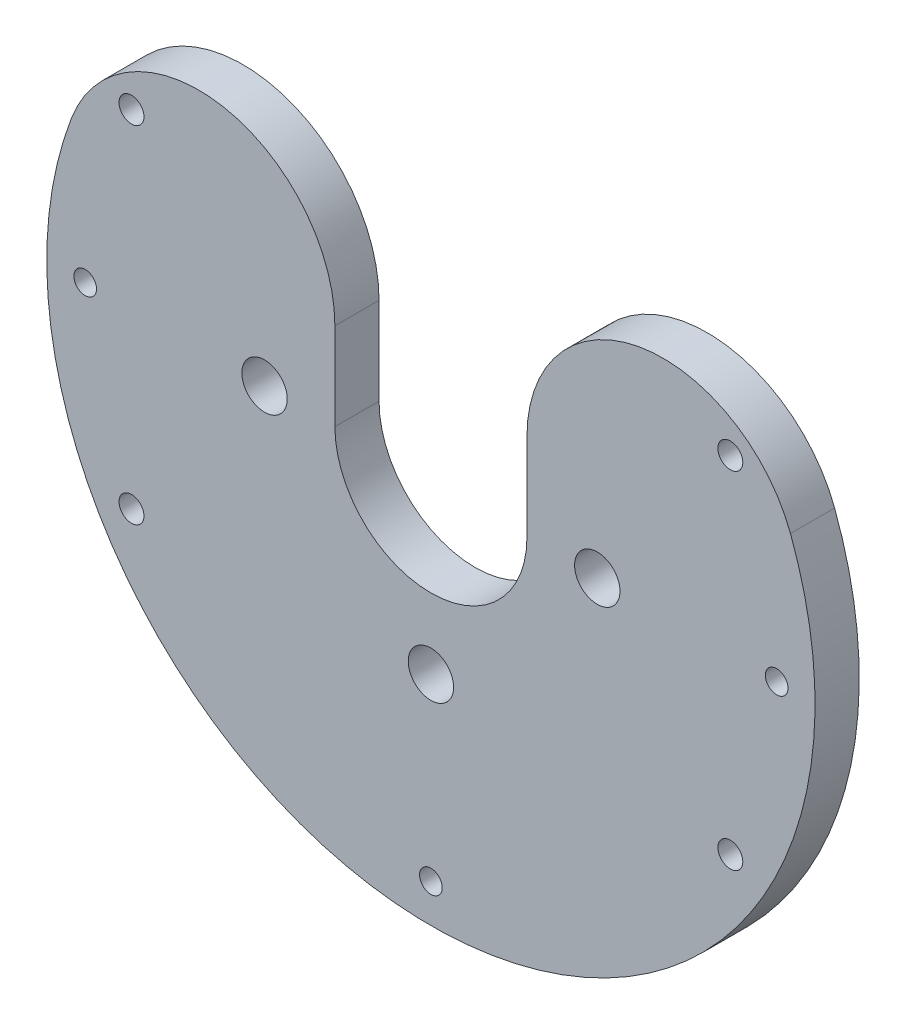
ISO-10303-21;
HEADER;
FILE_DESCRIPTION(('STEP AP214'),'2;1');
FILE_NAME('part.step','',(''),(''),'','','');
FILE_SCHEMA(('AUTOMOTIVE_DESIGN { 1 0 10303 214 1 1 1 1 }'));
ENDSEC;
DATA;
#1=APPLICATION_CONTEXT('core data for automotive mechanical design processes');
#2=APPLICATION_PROTOCOL_DEFINITION('international standard','automotive_design',2000,#1);
#3=PRODUCT_CONTEXT('',#1,'mechanical');
#4=PRODUCT('Part','Part','',(#3));
#5=PRODUCT_RELATED_PRODUCT_CATEGORY('part','',(#4));
#6=PRODUCT_DEFINITION_FORMATION('','',#4);
#7=PRODUCT_DEFINITION_CONTEXT('part definition',#1,'design');
#8=PRODUCT_DEFINITION('design','',#6,#7);
#9=PRODUCT_DEFINITION_SHAPE('','',#8);
#10=(LENGTH_UNIT() NAMED_UNIT(*) SI_UNIT(.MILLI.,.METRE.));
#11=(NAMED_UNIT(*) PLANE_ANGLE_UNIT() SI_UNIT($,.RADIAN.));
#12=(NAMED_UNIT(*) SI_UNIT($,.STERADIAN.) SOLID_ANGLE_UNIT());
#13=UNCERTAINTY_MEASURE_WITH_UNIT(LENGTH_MEASURE(1.E-05),#10,'distance_accuracy_value','');
#14=(GEOMETRIC_REPRESENTATION_CONTEXT(3) GLOBAL_UNCERTAINTY_ASSIGNED_CONTEXT((#13)) GLOBAL_UNIT_ASSIGNED_CONTEXT((#10,
#11,#12)) REPRESENTATION_CONTEXT('',''));
#15=CARTESIAN_POINT('',(0.,0.,0.));
#16=DIRECTION('',(0.,0.,1.));
#17=DIRECTION('',(1.,0.,0.));
#18=AXIS2_PLACEMENT_3D('',#15,#16,#17);
#19=CARTESIAN_POINT('',(0.,0.,5.842));
#20=DIRECTION('',(0.,0.,-1.));
#21=DIRECTION('',(-1.,0.,0.));
#22=AXIS2_PLACEMENT_3D('',#19,#20,#21);
#23=CYLINDRICAL_SURFACE('',#22,12.7);
#24=CARTESIAN_POINT('',(0.,0.,0.));
#25=DIRECTION('',(0.,0.,1.));
#26=DIRECTION('',(1.,0.,0.));
#27=AXIS2_PLACEMENT_3D('',#24,#25,#26);
#28=CIRCLE('',#27,12.7);
#29=CARTESIAN_POINT('',(-12.7,0.,0.));
#30=VERTEX_POINT('',#29);
#31=CARTESIAN_POINT('',(12.7,0.,0.));
#32=VERTEX_POINT('',#31);
#33=EDGE_CURVE('E97',#30,#32,#28,.T.);
#34=ORIENTED_EDGE('',*,*,#33,.F.);
#35=DIRECTION('',(0.,0.,-1.));
#36=VECTOR('',#35,1.);
#37=CARTESIAN_POINT('',(-12.7,0.,5.842));
#38=LINE('',#37,#36);
#39=CARTESIAN_POINT('',(-12.7,0.,5.842));
#40=VERTEX_POINT('',#39);
#41=EDGE_CURVE('E92',#40,#30,#38,.T.);
#42=ORIENTED_EDGE('',*,*,#41,.F.);
#43=CARTESIAN_POINT('',(0.,0.,5.842));
#44=DIRECTION('',(0.,0.,1.));
#45=DIRECTION('',(1.,0.,0.));
#46=AXIS2_PLACEMENT_3D('',#43,#44,#45);
#47=CIRCLE('',#46,12.7);
#48=CARTESIAN_POINT('',(12.7,0.,5.842));
#49=VERTEX_POINT('',#48);
#50=EDGE_CURVE('E94',#40,#49,#47,.T.);
#51=ORIENTED_EDGE('',*,*,#50,.T.);
#52=DIRECTION('',(0.,0.,-1.));
#53=VECTOR('',#52,1.);
#54=CARTESIAN_POINT('',(12.7,0.,5.842));
#55=LINE('',#54,#53);
#56=EDGE_CURVE('E100',#49,#32,#55,.T.);
#57=ORIENTED_EDGE('',*,*,#56,.T.);
#58=EDGE_LOOP('',(#34,#42,#51,#57));
#59=FACE_BOUND('',#58,.T.);
#60=ADVANCED_FACE('F37',(#59),#23,.F.);
#61=CARTESIAN_POINT('',(-12.7,0.,5.842));
#62=DIRECTION('',(-1.,0.,0.));
#63=DIRECTION('',(0.,0.,1.));
#64=AXIS2_PLACEMENT_3D('',#61,#62,#63);
#65=PLANE('',#64);
#66=DIRECTION('',(0.,1.,0.));
#67=VECTOR('',#66,1.);
#68=CARTESIAN_POINT('',(-12.7,0.,0.));
#69=LINE('',#68,#67);
#70=CARTESIAN_POINT('',(-12.7,11.5477270490777,0.));
#71=VERTEX_POINT('',#70);
#72=EDGE_CURVE('E151',#30,#71,#69,.T.);
#73=ORIENTED_EDGE('',*,*,#72,.T.);
#74=DIRECTION('',(0.,0.,-1.));
#75=VECTOR('',#74,1.);
#76=CARTESIAN_POINT('',(-12.7,11.5477270490777,5.842));
#77=LINE('',#76,#75);
#78=CARTESIAN_POINT('',(-12.7,11.5477270490777,5.842));
#79=VERTEX_POINT('',#78);
#80=EDGE_CURVE('E11',#71,#79,#77,.F.);
#81=ORIENTED_EDGE('',*,*,#80,.T.);
#82=DIRECTION('',(0.,1.,0.));
#83=VECTOR('',#82,1.);
#84=CARTESIAN_POINT('',(-12.7,0.,5.842));
#85=LINE('',#84,#83);
#86=EDGE_CURVE('E102',#40,#79,#85,.T.);
#87=ORIENTED_EDGE('',*,*,#86,.F.);
#88=ORIENTED_EDGE('',*,*,#41,.T.);
#89=EDGE_LOOP('',(#73,#81,#87,#88));
#90=FACE_BOUND('',#89,.T.);
#91=ADVANCED_FACE('F103',(#90),#65,.F.);
#92=CARTESIAN_POINT('',(0.,0.,5.842));
#93=DIRECTION('',(0.,0.,-1.));
#94=DIRECTION('',(-1.,0.,0.));
#95=AXIS2_PLACEMENT_3D('',#92,#93,#94);
#96=CYLINDRICAL_SURFACE('',#95,50.8);
#97=CARTESIAN_POINT('',(0.,0.,0.));
#98=DIRECTION('',(0.,0.,1.));
#99=DIRECTION('',(1.,0.,0.));
#100=AXIS2_PLACEMENT_3D('',#97,#98,#99);
#101=CIRCLE('',#100,50.8);
#102=CARTESIAN_POINT('',(-47.5475609756098,17.8848943321081,0.));
#103=VERTEX_POINT('',#102);
#104=CARTESIAN_POINT('',(47.5475609756098,17.8848943321081,0.));
#105=VERTEX_POINT('',#104);
#106=EDGE_CURVE('E153',#103,#105,#101,.T.);
#107=ORIENTED_EDGE('',*,*,#106,.T.);
#108=DIRECTION('',(0.,0.,-1.));
#109=VECTOR('',#108,1.);
#110=CARTESIAN_POINT('',(47.5475609756098,17.8848943321081,5.842));
#111=LINE('',#110,#109);
#112=CARTESIAN_POINT('',(47.5475609756098,17.8848943321081,5.842));
#113=VERTEX_POINT('',#112);
#114=EDGE_CURVE('E58',#105,#113,#111,.F.);
#115=ORIENTED_EDGE('',*,*,#114,.T.);
#116=CARTESIAN_POINT('',(0.,0.,5.842));
#117=DIRECTION('',(0.,0.,1.));
#118=DIRECTION('',(1.,0.,0.));
#119=AXIS2_PLACEMENT_3D('',#116,#117,#118);
#120=CIRCLE('',#119,50.8);
#121=CARTESIAN_POINT('',(-47.5475609756098,17.8848943321081,5.842));
#122=VERTEX_POINT('',#121);
#123=EDGE_CURVE('E106',#122,#113,#120,.T.);
#124=ORIENTED_EDGE('',*,*,#123,.F.);
#125=DIRECTION('',(0.,0.,-1.));
#126=VECTOR('',#125,1.);
#127=CARTESIAN_POINT('',(-47.5475609756098,17.8848943321081,5.842));
#128=LINE('',#127,#126);
#129=EDGE_CURVE('E166',#122,#103,#128,.T.);
#130=ORIENTED_EDGE('',*,*,#129,.T.);
#131=EDGE_LOOP('',(#107,#115,#124,#130));
#132=FACE_BOUND('',#131,.T.);
#133=ADVANCED_FACE('F181',(#132),#96,.T.);
#134=CARTESIAN_POINT('',(22.,0.,5.842));
#135=DIRECTION('',(0.,0.,-1.));
#136=DIRECTION('',(-1.,0.,0.));
#137=AXIS2_PLACEMENT_3D('',#134,#135,#136);
#138=CYLINDRICAL_SURFACE('',#137,3.);
#139=CARTESIAN_POINT('',(22.,0.,5.842));
#140=DIRECTION('',(0.,0.,1.));
#141=DIRECTION('',(1.,0.,0.));
#142=AXIS2_PLACEMENT_3D('',#139,#140,#141);
#143=CIRCLE('',#142,3.);
#144=CARTESIAN_POINT('',(25.,0.,5.842));
#145=VERTEX_POINT('',#144);
#146=EDGE_CURVE('E111',#145,#145,#143,.T.);
#147=ORIENTED_EDGE('',*,*,#146,.T.);
#148=EDGE_LOOP('',(#147));
#149=FACE_BOUND('',#148,.T.);
#150=CARTESIAN_POINT('',(22.,0.,0.));
#151=DIRECTION('',(0.,0.,1.));
#152=DIRECTION('',(1.,0.,0.));
#153=AXIS2_PLACEMENT_3D('',#150,#151,#152);
#154=CIRCLE('',#153,3.);
#155=CARTESIAN_POINT('',(25.,0.,0.));
#156=VERTEX_POINT('',#155);
#157=EDGE_CURVE('E147',#156,#156,#154,.T.);
#158=ORIENTED_EDGE('',*,*,#157,.F.);
#159=EDGE_LOOP('',(#158));
#160=FACE_BOUND('',#159,.T.);
#161=ADVANCED_FACE('F196',(#149,#160),#138,.F.);
#162=CARTESIAN_POINT('',(0.,-22.,5.842));
#163=DIRECTION('',(0.,0.,-1.));
#164=DIRECTION('',(-1.,0.,0.));
#165=AXIS2_PLACEMENT_3D('',#162,#163,#164);
#166=CYLINDRICAL_SURFACE('',#165,3.);
#167=CARTESIAN_POINT('',(0.,-22.,5.842));
#168=DIRECTION('',(0.,0.,1.));
#169=DIRECTION('',(1.,0.,0.));
#170=AXIS2_PLACEMENT_3D('',#167,#168,#169);
#171=CIRCLE('',#170,3.);
#172=CARTESIAN_POINT('',(3.,-22.,5.842));
#173=VERTEX_POINT('',#172);
#174=EDGE_CURVE('E114',#173,#173,#171,.T.);
#175=ORIENTED_EDGE('',*,*,#174,.T.);
#176=EDGE_LOOP('',(#175));
#177=FACE_BOUND('',#176,.T.);
#178=CARTESIAN_POINT('',(0.,-22.,0.));
#179=DIRECTION('',(0.,0.,1.));
#180=DIRECTION('',(1.,0.,0.));
#181=AXIS2_PLACEMENT_3D('',#178,#179,#180);
#182=CIRCLE('',#181,3.);
#183=CARTESIAN_POINT('',(3.,-22.,0.));
#184=VERTEX_POINT('',#183);
#185=EDGE_CURVE('E144',#184,#184,#182,.T.);
#186=ORIENTED_EDGE('',*,*,#185,.F.);
#187=EDGE_LOOP('',(#186));
#188=FACE_BOUND('',#187,.T.);
#189=ADVANCED_FACE('F199',(#177,#188),#166,.F.);
#190=CARTESIAN_POINT('',(-22.,0.,5.842));
#191=DIRECTION('',(0.,0.,-1.));
#192=DIRECTION('',(-1.,0.,0.));
#193=AXIS2_PLACEMENT_3D('',#190,#191,#192);
#194=CYLINDRICAL_SURFACE('',#193,3.);
#195=CARTESIAN_POINT('',(-22.,0.,5.842));
#196=DIRECTION('',(0.,0.,1.));
#197=DIRECTION('',(1.,0.,0.));
#198=AXIS2_PLACEMENT_3D('',#195,#196,#197);
#199=CIRCLE('',#198,3.);
#200=CARTESIAN_POINT('',(-19.,0.,5.842));
#201=VERTEX_POINT('',#200);
#202=EDGE_CURVE('E407',#201,#201,#199,.T.);
#203=ORIENTED_EDGE('',*,*,#202,.T.);
#204=EDGE_LOOP('',(#203));
#205=FACE_BOUND('',#204,.T.);
#206=CARTESIAN_POINT('',(-22.,0.,0.));
#207=DIRECTION('',(0.,0.,1.));
#208=DIRECTION('',(1.,0.,0.));
#209=AXIS2_PLACEMENT_3D('',#206,#207,#208);
#210=CIRCLE('',#209,3.);
#211=CARTESIAN_POINT('',(-19.,0.,0.));
#212=VERTEX_POINT('',#211);
#213=EDGE_CURVE('E141',#212,#212,#210,.T.);
#214=ORIENTED_EDGE('',*,*,#213,.F.);
#215=EDGE_LOOP('',(#214));
#216=FACE_BOUND('',#215,.T.);
#217=ADVANCED_FACE('F203',(#205,#216),#194,.F.);
#218=CARTESIAN_POINT('',(-45.72,0.,5.842));
#219=DIRECTION('',(0.,0.,-1.));
#220=DIRECTION('',(-1.,0.,0.));
#221=AXIS2_PLACEMENT_3D('',#218,#219,#220);
#222=CYLINDRICAL_SURFACE('',#221,1.5);
#223=CARTESIAN_POINT('',(-45.72,0.,5.842));
#224=DIRECTION('',(0.,0.,1.));
#225=DIRECTION('',(1.,0.,0.));
#226=AXIS2_PLACEMENT_3D('',#223,#224,#225);
#227=CIRCLE('',#226,1.5);
#228=CARTESIAN_POINT('',(-44.22,0.,5.842));
#229=VERTEX_POINT('',#228);
#230=EDGE_CURVE('E403',#229,#229,#227,.T.);
#231=ORIENTED_EDGE('',*,*,#230,.T.);
#232=EDGE_LOOP('',(#231));
#233=FACE_BOUND('',#232,.T.);
#234=CARTESIAN_POINT('',(-45.72,0.,0.));
#235=DIRECTION('',(0.,0.,1.));
#236=DIRECTION('',(1.,0.,0.));
#237=AXIS2_PLACEMENT_3D('',#234,#235,#236);
#238=CIRCLE('',#237,1.5);
#239=CARTESIAN_POINT('',(-44.22,0.,0.));
#240=VERTEX_POINT('',#239);
#241=EDGE_CURVE('E138',#240,#240,#238,.T.);
#242=ORIENTED_EDGE('',*,*,#241,.F.);
#243=EDGE_LOOP('',(#242));
#244=FACE_BOUND('',#243,.T.);
#245=ADVANCED_FACE('F207',(#233,#244),#222,.F.);
#246=CARTESIAN_POINT('',(45.72,0.,5.842));
#247=DIRECTION('',(0.,0.,-1.));
#248=DIRECTION('',(-1.,0.,0.));
#249=AXIS2_PLACEMENT_3D('',#246,#247,#248);
#250=CYLINDRICAL_SURFACE('',#249,1.5);
#251=CARTESIAN_POINT('',(45.72,0.,5.842));
#252=DIRECTION('',(0.,0.,1.));
#253=DIRECTION('',(1.,0.,0.));
#254=AXIS2_PLACEMENT_3D('',#251,#252,#253);
#255=CIRCLE('',#254,1.5);
#256=CARTESIAN_POINT('',(47.22,0.,5.842));
#257=VERTEX_POINT('',#256);
#258=EDGE_CURVE('E399',#257,#257,#255,.T.);
#259=ORIENTED_EDGE('',*,*,#258,.T.);
#260=EDGE_LOOP('',(#259));
#261=FACE_BOUND('',#260,.T.);
#262=CARTESIAN_POINT('',(45.72,0.,0.));
#263=DIRECTION('',(0.,0.,1.));
#264=DIRECTION('',(1.,0.,0.));
#265=AXIS2_PLACEMENT_3D('',#262,#263,#264);
#266=CIRCLE('',#265,1.5);
#267=CARTESIAN_POINT('',(47.22,0.,0.));
#268=VERTEX_POINT('',#267);
#269=EDGE_CURVE('E135',#268,#268,#266,.T.);
#270=ORIENTED_EDGE('',*,*,#269,.F.);
#271=EDGE_LOOP('',(#270));
#272=FACE_BOUND('',#271,.T.);
#273=ADVANCED_FACE('F211',(#261,#272),#250,.F.);
#274=CARTESIAN_POINT('',(0.,-45.72,5.842));
#275=DIRECTION('',(0.,0.,-1.));
#276=DIRECTION('',(-1.,0.,0.));
#277=AXIS2_PLACEMENT_3D('',#274,#275,#276);
#278=CYLINDRICAL_SURFACE('',#277,1.5);
#279=CARTESIAN_POINT('',(0.,-45.72,5.842));
#280=DIRECTION('',(0.,0.,1.));
#281=DIRECTION('',(1.,0.,0.));
#282=AXIS2_PLACEMENT_3D('',#279,#280,#281);
#283=CIRCLE('',#282,1.5);
#284=CARTESIAN_POINT('',(1.50000000000001,-45.72,5.842));
#285=VERTEX_POINT('',#284);
#286=EDGE_CURVE('E395',#285,#285,#283,.T.);
#287=ORIENTED_EDGE('',*,*,#286,.T.);
#288=EDGE_LOOP('',(#287));
#289=FACE_BOUND('',#288,.T.);
#290=CARTESIAN_POINT('',(0.,-45.72,0.));
#291=DIRECTION('',(0.,0.,1.));
#292=DIRECTION('',(1.,0.,0.));
#293=AXIS2_PLACEMENT_3D('',#290,#291,#292);
#294=CIRCLE('',#293,1.5);
#295=CARTESIAN_POINT('',(1.50000000000001,-45.72,0.));
#296=VERTEX_POINT('',#295);
#297=EDGE_CURVE('E132',#296,#296,#294,.T.);
#298=ORIENTED_EDGE('',*,*,#297,.F.);
#299=EDGE_LOOP('',(#298));
#300=FACE_BOUND('',#299,.T.);
#301=ADVANCED_FACE('F215',(#289,#300),#278,.F.);
#302=CARTESIAN_POINT('',(39.5946814610245,22.86,5.842));
#303=DIRECTION('',(0.,0.,-1.));
#304=DIRECTION('',(-1.,0.,0.));
#305=AXIS2_PLACEMENT_3D('',#302,#303,#304);
#306=CYLINDRICAL_SURFACE('',#305,1.65);
#307=CARTESIAN_POINT('',(39.5946814610245,22.86,5.842));
#308=DIRECTION('',(0.,0.,1.));
#309=DIRECTION('',(1.,0.,0.));
#310=AXIS2_PLACEMENT_3D('',#307,#308,#309);
#311=CIRCLE('',#310,1.65);
#312=CARTESIAN_POINT('',(41.2446814610245,22.86,5.842));
#313=VERTEX_POINT('',#312);
#314=EDGE_CURVE('E391',#313,#313,#311,.T.);
#315=ORIENTED_EDGE('',*,*,#314,.T.);
#316=EDGE_LOOP('',(#315));
#317=FACE_BOUND('',#316,.T.);
#318=CARTESIAN_POINT('',(39.5946814610245,22.86,0.));
#319=DIRECTION('',(0.,0.,1.));
#320=DIRECTION('',(1.,0.,0.));
#321=AXIS2_PLACEMENT_3D('',#318,#319,#320);
#322=CIRCLE('',#321,1.65);
#323=CARTESIAN_POINT('',(41.2446814610245,22.86,0.));
#324=VERTEX_POINT('',#323);
#325=EDGE_CURVE('E129',#324,#324,#322,.T.);
#326=ORIENTED_EDGE('',*,*,#325,.F.);
#327=EDGE_LOOP('',(#326));
#328=FACE_BOUND('',#327,.T.);
#329=ADVANCED_FACE('F219',(#317,#328),#306,.F.);
#330=CARTESIAN_POINT('',(39.5946814610245,-22.86,5.842));
#331=DIRECTION('',(0.,0.,-1.));
#332=DIRECTION('',(-1.,0.,0.));
#333=AXIS2_PLACEMENT_3D('',#330,#331,#332);
#334=CYLINDRICAL_SURFACE('',#333,1.65);
#335=CARTESIAN_POINT('',(39.5946814610245,-22.86,5.842));
#336=DIRECTION('',(0.,0.,1.));
#337=DIRECTION('',(1.,0.,0.));
#338=AXIS2_PLACEMENT_3D('',#335,#336,#337);
#339=CIRCLE('',#338,1.65);
#340=CARTESIAN_POINT('',(41.2446814610245,-22.86,5.842));
#341=VERTEX_POINT('',#340);
#342=EDGE_CURVE('E387',#341,#341,#339,.T.);
#343=ORIENTED_EDGE('',*,*,#342,.T.);
#344=EDGE_LOOP('',(#343));
#345=FACE_BOUND('',#344,.T.);
#346=CARTESIAN_POINT('',(39.5946814610245,-22.86,0.));
#347=DIRECTION('',(0.,0.,1.));
#348=DIRECTION('',(1.,0.,0.));
#349=AXIS2_PLACEMENT_3D('',#346,#347,#348);
#350=CIRCLE('',#349,1.65);
#351=CARTESIAN_POINT('',(41.2446814610245,-22.86,0.));
#352=VERTEX_POINT('',#351);
#353=EDGE_CURVE('E126',#352,#352,#350,.T.);
#354=ORIENTED_EDGE('',*,*,#353,.F.);
#355=EDGE_LOOP('',(#354));
#356=FACE_BOUND('',#355,.T.);
#357=ADVANCED_FACE('F223',(#345,#356),#334,.F.);
#358=CARTESIAN_POINT('',(-39.5946814610245,-22.86,5.842));
#359=DIRECTION('',(0.,0.,-1.));
#360=DIRECTION('',(-1.,0.,0.));
#361=AXIS2_PLACEMENT_3D('',#358,#359,#360);
#362=CYLINDRICAL_SURFACE('',#361,1.65);
#363=CARTESIAN_POINT('',(-39.5946814610245,-22.86,5.842));
#364=DIRECTION('',(0.,0.,1.));
#365=DIRECTION('',(1.,0.,0.));
#366=AXIS2_PLACEMENT_3D('',#363,#364,#365);
#367=CIRCLE('',#366,1.65);
#368=CARTESIAN_POINT('',(-37.9446814610245,-22.86,5.842));
#369=VERTEX_POINT('',#368);
#370=EDGE_CURVE('E383',#369,#369,#367,.T.);
#371=ORIENTED_EDGE('',*,*,#370,.T.);
#372=EDGE_LOOP('',(#371));
#373=FACE_BOUND('',#372,.T.);
#374=CARTESIAN_POINT('',(-39.5946814610245,-22.86,0.));
#375=DIRECTION('',(0.,0.,1.));
#376=DIRECTION('',(1.,0.,0.));
#377=AXIS2_PLACEMENT_3D('',#374,#375,#376);
#378=CIRCLE('',#377,1.65);
#379=CARTESIAN_POINT('',(-37.9446814610245,-22.86,0.));
#380=VERTEX_POINT('',#379);
#381=EDGE_CURVE('E123',#380,#380,#378,.T.);
#382=ORIENTED_EDGE('',*,*,#381,.F.);
#383=EDGE_LOOP('',(#382));
#384=FACE_BOUND('',#383,.T.);
#385=ADVANCED_FACE('F227',(#373,#384),#362,.F.);
#386=CARTESIAN_POINT('',(-39.5946814610245,22.86,5.842));
#387=DIRECTION('',(0.,0.,-1.));
#388=DIRECTION('',(-1.,0.,0.));
#389=AXIS2_PLACEMENT_3D('',#386,#387,#388);
#390=CYLINDRICAL_SURFACE('',#389,1.65);
#391=CARTESIAN_POINT('',(-39.5946814610245,22.86,5.842));
#392=DIRECTION('',(0.,0.,1.));
#393=DIRECTION('',(1.,0.,0.));
#394=AXIS2_PLACEMENT_3D('',#391,#392,#393);
#395=CIRCLE('',#394,1.65);
#396=CARTESIAN_POINT('',(-37.9446814610246,22.86,5.842));
#397=VERTEX_POINT('',#396);
#398=EDGE_CURVE('E158',#397,#397,#395,.T.);
#399=ORIENTED_EDGE('',*,*,#398,.T.);
#400=EDGE_LOOP('',(#399));
#401=FACE_BOUND('',#400,.T.);
#402=CARTESIAN_POINT('',(-39.5946814610245,22.86,0.));
#403=DIRECTION('',(0.,0.,1.));
#404=DIRECTION('',(1.,0.,0.));
#405=AXIS2_PLACEMENT_3D('',#402,#403,#404);
#406=CIRCLE('',#405,1.65);
#407=CARTESIAN_POINT('',(-37.9446814610246,22.86,0.));
#408=VERTEX_POINT('',#407);
#409=EDGE_CURVE('E120',#408,#408,#406,.T.);
#410=ORIENTED_EDGE('',*,*,#409,.F.);
#411=EDGE_LOOP('',(#410));
#412=FACE_BOUND('',#411,.T.);
#413=ADVANCED_FACE('F231',(#401,#412),#390,.F.);
#414=CARTESIAN_POINT('',(12.7,0.,5.842));
#415=DIRECTION('',(-1.,0.,0.));
#416=DIRECTION('',(0.,0.,1.));
#417=AXIS2_PLACEMENT_3D('',#414,#415,#416);
#418=PLANE('',#417);
#419=DIRECTION('',(0.,1.,0.));
#420=VECTOR('',#419,1.);
#421=CARTESIAN_POINT('',(12.7,0.,5.842));
#422=LINE('',#421,#420);
#423=CARTESIAN_POINT('',(12.7,11.5477270490777,5.842));
#424=VERTEX_POINT('',#423);
#425=EDGE_CURVE('E110',#49,#424,#422,.T.);
#426=ORIENTED_EDGE('',*,*,#425,.T.);
#427=DIRECTION('',(0.,0.,1.));
#428=VECTOR('',#427,1.);
#429=CARTESIAN_POINT('',(12.7,11.5477270490777,0.));
#430=LINE('',#429,#428);
#431=CARTESIAN_POINT('',(12.7,11.5477270490777,0.));
#432=VERTEX_POINT('',#431);
#433=EDGE_CURVE('E99',#424,#432,#430,.F.);
#434=ORIENTED_EDGE('',*,*,#433,.T.);
#435=DIRECTION('',(0.,1.,0.));
#436=VECTOR('',#435,1.);
#437=CARTESIAN_POINT('',(12.7,0.,0.));
#438=LINE('',#437,#436);
#439=EDGE_CURVE('E155',#32,#432,#438,.T.);
#440=ORIENTED_EDGE('',*,*,#439,.F.);
#441=ORIENTED_EDGE('',*,*,#56,.F.);
#442=EDGE_LOOP('',(#426,#434,#440,#441));
#443=FACE_BOUND('',#442,.T.);
#444=ADVANCED_FACE('F175',(#443),#418,.T.);
#445=CARTESIAN_POINT('',(0.,0.,5.842));
#446=DIRECTION('',(0.,0.,1.));
#447=DIRECTION('',(1.,0.,0.));
#448=AXIS2_PLACEMENT_3D('',#445,#446,#447);
#449=PLANE('',#448);
#450=ORIENTED_EDGE('',*,*,#398,.F.);
#451=EDGE_LOOP('',(#450));
#452=FACE_BOUND('',#451,.T.);
#453=ORIENTED_EDGE('',*,*,#370,.F.);
#454=EDGE_LOOP('',(#453));
#455=FACE_BOUND('',#454,.T.);
#456=ORIENTED_EDGE('',*,*,#342,.F.);
#457=EDGE_LOOP('',(#456));
#458=FACE_BOUND('',#457,.T.);
#459=ORIENTED_EDGE('',*,*,#314,.F.);
#460=EDGE_LOOP('',(#459));
#461=FACE_BOUND('',#460,.T.);
#462=ORIENTED_EDGE('',*,*,#286,.F.);
#463=EDGE_LOOP('',(#462));
#464=FACE_BOUND('',#463,.T.);
#465=ORIENTED_EDGE('',*,*,#258,.F.);
#466=EDGE_LOOP('',(#465));
#467=FACE_BOUND('',#466,.T.);
#468=ORIENTED_EDGE('',*,*,#230,.F.);
#469=EDGE_LOOP('',(#468));
#470=FACE_BOUND('',#469,.T.);
#471=ORIENTED_EDGE('',*,*,#202,.F.);
#472=EDGE_LOOP('',(#471));
#473=FACE_BOUND('',#472,.T.);
#474=ORIENTED_EDGE('',*,*,#174,.F.);
#475=EDGE_LOOP('',(#474));
#476=FACE_BOUND('',#475,.T.);
#477=ORIENTED_EDGE('',*,*,#146,.F.);
#478=EDGE_LOOP('',(#477));
#479=FACE_BOUND('',#478,.T.);
#480=ORIENTED_EDGE('',*,*,#123,.T.);
#481=CARTESIAN_POINT('',(30.7,11.5477270490777,5.842));
#482=DIRECTION('',(0.,0.,1.));
#483=DIRECTION('',(1.,0.,0.));
#484=AXIS2_PLACEMENT_3D('',#481,#482,#483);
#485=CIRCLE('',#484,18.);
#486=EDGE_CURVE('E45',#113,#424,#485,.T.);
#487=ORIENTED_EDGE('',*,*,#486,.T.);
#488=ORIENTED_EDGE('',*,*,#425,.F.);
#489=ORIENTED_EDGE('',*,*,#50,.F.);
#490=ORIENTED_EDGE('',*,*,#86,.T.);
#491=CARTESIAN_POINT('',(-30.7,11.5477270490777,5.842));
#492=DIRECTION('',(0.,0.,1.));
#493=DIRECTION('',(1.,0.,0.));
#494=AXIS2_PLACEMENT_3D('',#491,#492,#493);
#495=CIRCLE('',#494,18.);
#496=EDGE_CURVE('E170',#79,#122,#495,.T.);
#497=ORIENTED_EDGE('',*,*,#496,.T.);
#498=EDGE_LOOP('',(#480,#487,#488,#489,#490,#497));
#499=FACE_BOUND('',#498,.T.);
#500=ADVANCED_FACE('F108',(#452,#455,#458,#461,#464,#467,#470,#473,#476,#479,#499),#449,.T.);
#501=CARTESIAN_POINT('',(0.,0.,0.));
#502=DIRECTION('',(0.,0.,1.));
#503=DIRECTION('',(1.,0.,0.));
#504=AXIS2_PLACEMENT_3D('',#501,#502,#503);
#505=PLANE('',#504);
#506=ORIENTED_EDGE('',*,*,#409,.T.);
#507=EDGE_LOOP('',(#506));
#508=FACE_BOUND('',#507,.T.);
#509=ORIENTED_EDGE('',*,*,#381,.T.);
#510=EDGE_LOOP('',(#509));
#511=FACE_BOUND('',#510,.T.);
#512=ORIENTED_EDGE('',*,*,#353,.T.);
#513=EDGE_LOOP('',(#512));
#514=FACE_BOUND('',#513,.T.);
#515=ORIENTED_EDGE('',*,*,#325,.T.);
#516=EDGE_LOOP('',(#515));
#517=FACE_BOUND('',#516,.T.);
#518=ORIENTED_EDGE('',*,*,#297,.T.);
#519=EDGE_LOOP('',(#518));
#520=FACE_BOUND('',#519,.T.);
#521=ORIENTED_EDGE('',*,*,#269,.T.);
#522=EDGE_LOOP('',(#521));
#523=FACE_BOUND('',#522,.T.);
#524=ORIENTED_EDGE('',*,*,#241,.T.);
#525=EDGE_LOOP('',(#524));
#526=FACE_BOUND('',#525,.T.);
#527=ORIENTED_EDGE('',*,*,#213,.T.);
#528=EDGE_LOOP('',(#527));
#529=FACE_BOUND('',#528,.T.);
#530=ORIENTED_EDGE('',*,*,#185,.T.);
#531=EDGE_LOOP('',(#530));
#532=FACE_BOUND('',#531,.T.);
#533=ORIENTED_EDGE('',*,*,#157,.T.);
#534=EDGE_LOOP('',(#533));
#535=FACE_BOUND('',#534,.T.);
#536=ORIENTED_EDGE('',*,*,#439,.T.);
#537=CARTESIAN_POINT('',(30.7,11.5477270490777,0.));
#538=DIRECTION('',(0.,0.,1.));
#539=DIRECTION('',(1.,0.,0.));
#540=AXIS2_PLACEMENT_3D('',#537,#538,#539);
#541=CIRCLE('',#540,18.);
#542=EDGE_CURVE('E164',#432,#105,#541,.F.);
#543=ORIENTED_EDGE('',*,*,#542,.T.);
#544=ORIENTED_EDGE('',*,*,#106,.F.);
#545=CARTESIAN_POINT('',(-30.7,11.5477270490777,0.));
#546=DIRECTION('',(0.,0.,1.));
#547=DIRECTION('',(1.,0.,0.));
#548=AXIS2_PLACEMENT_3D('',#545,#546,#547);
#549=CIRCLE('',#548,18.);
#550=EDGE_CURVE('E162',#103,#71,#549,.F.);
#551=ORIENTED_EDGE('',*,*,#550,.T.);
#552=ORIENTED_EDGE('',*,*,#72,.F.);
#553=ORIENTED_EDGE('',*,*,#33,.T.);
#554=EDGE_LOOP('',(#536,#543,#544,#551,#552,#553));
#555=FACE_BOUND('',#554,.T.);
#556=ADVANCED_FACE('F180',(#508,#511,#514,#517,#520,#523,#526,#529,#532,#535,#555),#505,.F.);
#557=CARTESIAN_POINT('',(30.7,11.5477270490777,5.842));
#558=DIRECTION('',(0.,0.,-1.));
#559=DIRECTION('',(-1.,0.,0.));
#560=AXIS2_PLACEMENT_3D('',#557,#558,#559);
#561=CYLINDRICAL_SURFACE('',#560,18.);
#562=ORIENTED_EDGE('',*,*,#486,.F.);
#563=ORIENTED_EDGE('',*,*,#114,.F.);
#564=ORIENTED_EDGE('',*,*,#542,.F.);
#565=ORIENTED_EDGE('',*,*,#433,.F.);
#566=EDGE_LOOP('',(#562,#563,#564,#565));
#567=FACE_BOUND('',#566,.T.);
#568=ADVANCED_FACE('F177',(#567),#561,.T.);
#569=CARTESIAN_POINT('',(-30.7,11.5477270490777,5.842));
#570=DIRECTION('',(0.,0.,-1.));
#571=DIRECTION('',(-1.,0.,0.));
#572=AXIS2_PLACEMENT_3D('',#569,#570,#571);
#573=CYLINDRICAL_SURFACE('',#572,18.);
#574=ORIENTED_EDGE('',*,*,#496,.F.);
#575=ORIENTED_EDGE('',*,*,#80,.F.);
#576=ORIENTED_EDGE('',*,*,#550,.F.);
#577=ORIENTED_EDGE('',*,*,#129,.F.);
#578=EDGE_LOOP('',(#574,#575,#576,#577));
#579=FACE_BOUND('',#578,.T.);
#580=ADVANCED_FACE('F39',(#579),#573,.T.);
#581=CLOSED_SHELL('',(#60,#91,#133,#161,#189,#217,#245,#273,#301,#329,#357,#385,#413,#444,#500,
#556,#568,#580));
#582=MANIFOLD_SOLID_BREP('B2',#581);
#583=ADVANCED_BREP_SHAPE_REPRESENTATION('',(#18,#582),#14);
#584=SHAPE_DEFINITION_REPRESENTATION(#9,#583);
ENDSEC;
END-ISO-10303-21;
